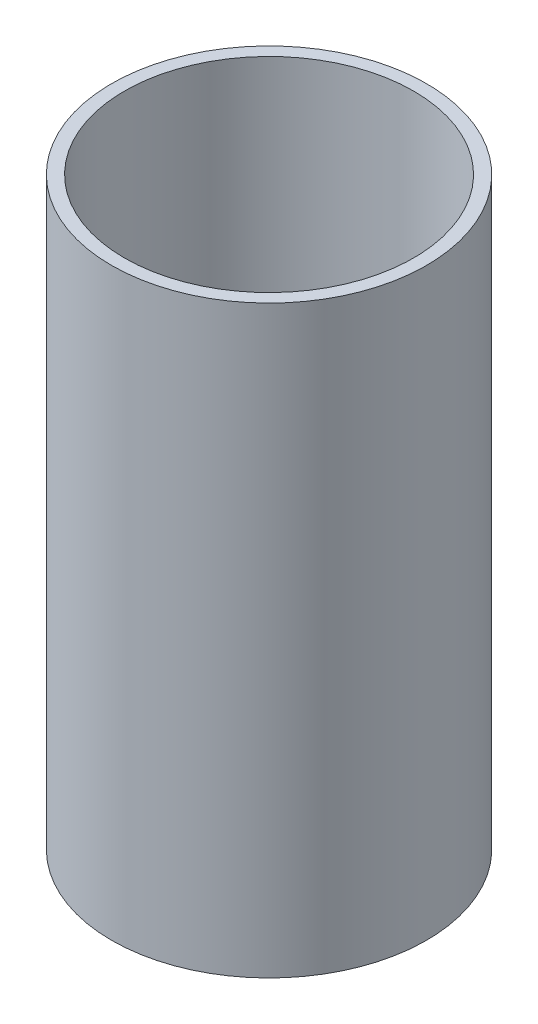
ISO-10303-21;
HEADER;
FILE_DESCRIPTION(('STEP AP214'),'2;1');
FILE_NAME('part.step','',(''),(''),'','','');
FILE_SCHEMA(('AUTOMOTIVE_DESIGN { 1 0 10303 214 1 1 1 1 }'));
ENDSEC;
DATA;
#1=APPLICATION_CONTEXT('core data for automotive mechanical design processes');
#2=APPLICATION_PROTOCOL_DEFINITION('international standard','automotive_design',2000,#1);
#3=PRODUCT_CONTEXT('',#1,'mechanical');
#4=PRODUCT('Part','Part','',(#3));
#5=PRODUCT_RELATED_PRODUCT_CATEGORY('part','',(#4));
#6=PRODUCT_DEFINITION_FORMATION('','',#4);
#7=PRODUCT_DEFINITION_CONTEXT('part definition',#1,'design');
#8=PRODUCT_DEFINITION('design','',#6,#7);
#9=PRODUCT_DEFINITION_SHAPE('','',#8);
#10=(LENGTH_UNIT() NAMED_UNIT(*) SI_UNIT(.MILLI.,.METRE.));
#11=(NAMED_UNIT(*) PLANE_ANGLE_UNIT() SI_UNIT($,.RADIAN.));
#12=(NAMED_UNIT(*) SI_UNIT($,.STERADIAN.) SOLID_ANGLE_UNIT());
#13=UNCERTAINTY_MEASURE_WITH_UNIT(LENGTH_MEASURE(1.E-05),#10,'distance_accuracy_value','');
#14=(GEOMETRIC_REPRESENTATION_CONTEXT(3) GLOBAL_UNCERTAINTY_ASSIGNED_CONTEXT((#13)) GLOBAL_UNIT_ASSIGNED_CONTEXT((#10,
#11,#12)) REPRESENTATION_CONTEXT('',''));
#15=CARTESIAN_POINT('',(0.,0.,0.));
#16=DIRECTION('',(0.,0.,1.));
#17=DIRECTION('',(1.,0.,0.));
#18=AXIS2_PLACEMENT_3D('',#15,#16,#17);
#19=CARTESIAN_POINT('',(0.,49.022,0.));
#20=DIRECTION('',(0.,-1.,0.));
#21=DIRECTION('',(0.,0.,-1.));
#22=AXIS2_PLACEMENT_3D('',#19,#20,#21);
#23=CYLINDRICAL_SURFACE('',#22,13.208);
#24=CARTESIAN_POINT('',(0.,49.022,0.));
#25=DIRECTION('',(0.,1.,0.));
#26=DIRECTION('',(0.,0.,1.));
#27=AXIS2_PLACEMENT_3D('',#24,#25,#26);
#28=CIRCLE('',#27,13.208);
#29=CARTESIAN_POINT('',(0.,49.022,13.208));
#30=VERTEX_POINT('',#29);
#31=EDGE_CURVE('E11',#30,#30,#28,.T.);
#32=ORIENTED_EDGE('',*,*,#31,.F.);
#33=EDGE_LOOP('',(#32));
#34=FACE_BOUND('',#33,.T.);
#35=CARTESIAN_POINT('',(0.,0.,0.));
#36=DIRECTION('',(0.,1.,0.));
#37=DIRECTION('',(0.,0.,1.));
#38=AXIS2_PLACEMENT_3D('',#35,#36,#37);
#39=CIRCLE('',#38,13.208);
#40=CARTESIAN_POINT('',(0.,0.,13.208));
#41=VERTEX_POINT('',#40);
#42=EDGE_CURVE('E39',#41,#41,#39,.T.);
#43=ORIENTED_EDGE('',*,*,#42,.T.);
#44=EDGE_LOOP('',(#43));
#45=FACE_BOUND('',#44,.T.);
#46=ADVANCED_FACE('F36',(#34,#45),#23,.T.);
#47=CARTESIAN_POINT('',(0.,49.022,0.));
#48=DIRECTION('',(0.,1.,0.));
#49=DIRECTION('',(0.,0.,1.));
#50=AXIS2_PLACEMENT_3D('',#47,#48,#49);
#51=PLANE('',#50);
#52=CARTESIAN_POINT('',(0.,49.022,0.));
#53=DIRECTION('',(0.,1.,0.));
#54=DIRECTION('',(0.,0.,1.));
#55=AXIS2_PLACEMENT_3D('',#52,#53,#54);
#56=CIRCLE('',#55,12.1285);
#57=CARTESIAN_POINT('',(0.,49.022,12.1285));
#58=VERTEX_POINT('',#57);
#59=EDGE_CURVE('E50',#58,#58,#56,.T.);
#60=ORIENTED_EDGE('',*,*,#59,.F.);
#61=EDGE_LOOP('',(#60));
#62=FACE_BOUND('',#61,.T.);
#63=ORIENTED_EDGE('',*,*,#31,.T.);
#64=EDGE_LOOP('',(#63));
#65=FACE_BOUND('',#64,.T.);
#66=ADVANCED_FACE('F56',(#62,#65),#51,.T.);
#67=CARTESIAN_POINT('',(0.,0.,0.));
#68=DIRECTION('',(0.,1.,0.));
#69=DIRECTION('',(0.,0.,1.));
#70=AXIS2_PLACEMENT_3D('',#67,#68,#69);
#71=PLANE('',#70);
#72=ORIENTED_EDGE('',*,*,#42,.F.);
#73=EDGE_LOOP('',(#72));
#74=FACE_BOUND('',#73,.T.);
#75=ADVANCED_FACE('F58',(#74),#71,.F.);
#76=CARTESIAN_POINT('',(0.,-34.3045783824842,0.));
#77=DIRECTION('',(0.,1.,0.));
#78=DIRECTION('',(0.,0.,1.));
#79=AXIS2_PLACEMENT_3D('',#76,#77,#78);
#80=CYLINDRICAL_SURFACE('',#79,12.1285);
#81=CARTESIAN_POINT('',(0.,1.905,0.));
#82=DIRECTION('',(0.,1.,0.));
#83=DIRECTION('',(0.,0.,1.));
#84=AXIS2_PLACEMENT_3D('',#81,#82,#83);
#85=CIRCLE('',#84,12.1285);
#86=CARTESIAN_POINT('',(0.,1.905,12.1285));
#87=VERTEX_POINT('',#86);
#88=EDGE_CURVE('E46',#87,#87,#85,.F.);
#89=ORIENTED_EDGE('',*,*,#88,.T.);
#90=EDGE_LOOP('',(#89));
#91=FACE_BOUND('',#90,.T.);
#92=ORIENTED_EDGE('',*,*,#59,.T.);
#93=EDGE_LOOP('',(#92));
#94=FACE_BOUND('',#93,.T.);
#95=ADVANCED_FACE('F54',(#91,#94),#80,.F.);
#96=CARTESIAN_POINT('',(0.,1.905,0.));
#97=DIRECTION('',(0.,1.,0.));
#98=DIRECTION('',(0.,0.,1.));
#99=AXIS2_PLACEMENT_3D('',#96,#97,#98);
#100=PLANE('',#99);
#101=ORIENTED_EDGE('',*,*,#88,.F.);
#102=EDGE_LOOP('',(#101));
#103=FACE_BOUND('',#102,.T.);
#104=ADVANCED_FACE('F69',(#103),#100,.T.);
#105=CLOSED_SHELL('',(#46,#66,#75,#95,#104));
#106=MANIFOLD_SOLID_BREP('B2',#105);
#107=ADVANCED_BREP_SHAPE_REPRESENTATION('',(#18,#106),#14);
#108=SHAPE_DEFINITION_REPRESENTATION(#9,#107);
ENDSEC;
END-ISO-10303-21;
